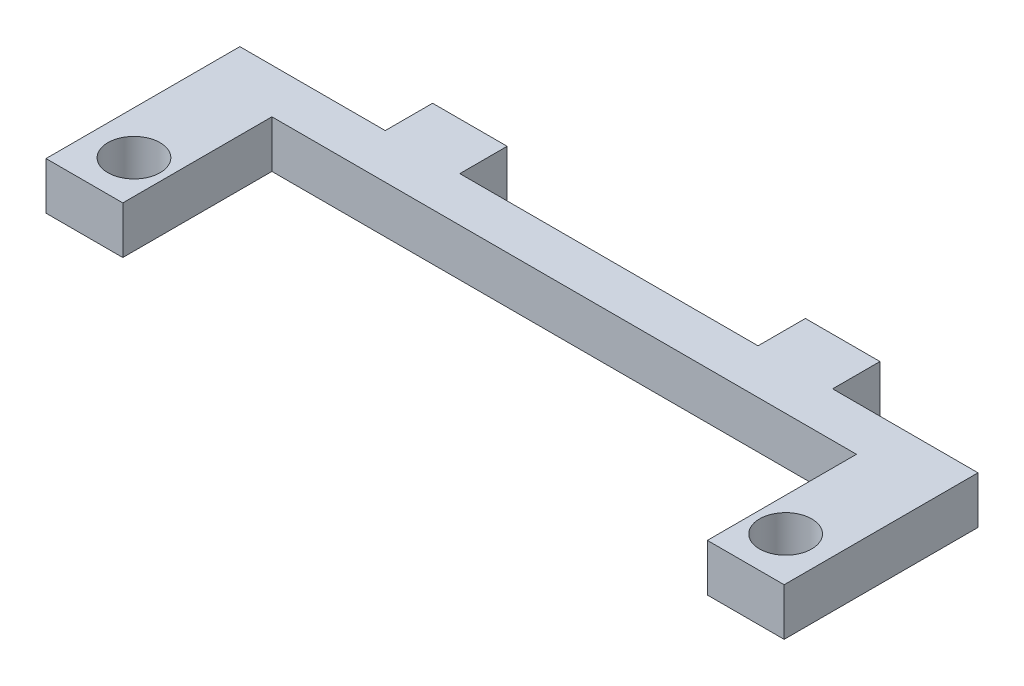
ISO-10303-21;
HEADER;
FILE_DESCRIPTION(('STEP AP214'),'2;1');
FILE_NAME('part.step','',(''),(''),'','','');
FILE_SCHEMA(('AUTOMOTIVE_DESIGN { 1 0 10303 214 1 1 1 1 }'));
ENDSEC;
DATA;
#1=APPLICATION_CONTEXT('core data for automotive mechanical design processes');
#2=APPLICATION_PROTOCOL_DEFINITION('international standard','automotive_design',2000,#1);
#3=PRODUCT_CONTEXT('',#1,'mechanical');
#4=PRODUCT('Part','Part','',(#3));
#5=PRODUCT_RELATED_PRODUCT_CATEGORY('part','',(#4));
#6=PRODUCT_DEFINITION_FORMATION('','',#4);
#7=PRODUCT_DEFINITION_CONTEXT('part definition',#1,'design');
#8=PRODUCT_DEFINITION('design','',#6,#7);
#9=PRODUCT_DEFINITION_SHAPE('','',#8);
#10=(LENGTH_UNIT() NAMED_UNIT(*) SI_UNIT(.MILLI.,.METRE.));
#11=(NAMED_UNIT(*) PLANE_ANGLE_UNIT() SI_UNIT($,.RADIAN.));
#12=(NAMED_UNIT(*) SI_UNIT($,.STERADIAN.) SOLID_ANGLE_UNIT());
#13=UNCERTAINTY_MEASURE_WITH_UNIT(LENGTH_MEASURE(1.E-05),#10,'distance_accuracy_value','');
#14=(GEOMETRIC_REPRESENTATION_CONTEXT(3) GLOBAL_UNCERTAINTY_ASSIGNED_CONTEXT((#13)) GLOBAL_UNIT_ASSIGNED_CONTEXT((#10,
#11,#12)) REPRESENTATION_CONTEXT('',''));
#15=CARTESIAN_POINT('',(0.,0.,0.));
#16=DIRECTION('',(0.,0.,1.));
#17=DIRECTION('',(1.,0.,0.));
#18=AXIS2_PLACEMENT_3D('',#15,#16,#17);
#19=CARTESIAN_POINT('',(0.,3.175,0.));
#20=DIRECTION('',(0.,1.,0.));
#21=DIRECTION('',(0.,0.,1.));
#22=AXIS2_PLACEMENT_3D('',#19,#20,#21);
#23=PLANE('',#22);
#24=CARTESIAN_POINT('',(-21.85,3.175,0.));
#25=DIRECTION('',(0.,1.,0.));
#26=DIRECTION('',(0.,0.,1.));
#27=AXIS2_PLACEMENT_3D('',#24,#25,#26);
#28=CIRCLE('',#27,1.75);
#29=CARTESIAN_POINT('',(-21.85,3.175,1.75));
#30=VERTEX_POINT('',#29);
#31=EDGE_CURVE('E182',#30,#30,#28,.T.);
#32=ORIENTED_EDGE('',*,*,#31,.F.);
#33=EDGE_LOOP('',(#32));
#34=FACE_BOUND('',#33,.T.);
#35=DIRECTION('',(-1.,0.,0.));
#36=VECTOR('',#35,1.);
#37=CARTESIAN_POINT('',(15.,3.175,-10.));
#38=LINE('',#37,#36);
#39=CARTESIAN_POINT('',(24.75,3.175,-10.));
#40=VERTEX_POINT('',#39);
#41=CARTESIAN_POINT('',(15.,3.175,-10.));
#42=VERTEX_POINT('',#41);
#43=EDGE_CURVE('E209',#40,#42,#38,.T.);
#44=ORIENTED_EDGE('',*,*,#43,.T.);
#45=DIRECTION('',(0.,0.,-1.));
#46=VECTOR('',#45,1.);
#47=CARTESIAN_POINT('',(15.,3.175,-10.));
#48=LINE('',#47,#46);
#49=CARTESIAN_POINT('',(15.,3.175,-13.175));
#50=VERTEX_POINT('',#49);
#51=EDGE_CURVE('E117',#42,#50,#48,.T.);
#52=ORIENTED_EDGE('',*,*,#51,.T.);
#53=DIRECTION('',(-1.,0.,0.));
#54=VECTOR('',#53,1.);
#55=CARTESIAN_POINT('',(10.,3.175,-13.175));
#56=LINE('',#55,#54);
#57=CARTESIAN_POINT('',(10.,3.175,-13.175));
#58=VERTEX_POINT('',#57);
#59=EDGE_CURVE('E248',#50,#58,#56,.T.);
#60=ORIENTED_EDGE('',*,*,#59,.T.);
#61=DIRECTION('',(0.,0.,1.));
#62=VECTOR('',#61,1.);
#63=CARTESIAN_POINT('',(10.,3.175,-10.));
#64=LINE('',#63,#62);
#65=CARTESIAN_POINT('',(10.,3.175,-10.));
#66=VERTEX_POINT('',#65);
#67=EDGE_CURVE('E267',#58,#66,#64,.T.);
#68=ORIENTED_EDGE('',*,*,#67,.T.);
#69=DIRECTION('',(-1.,0.,0.));
#70=VECTOR('',#69,1.);
#71=CARTESIAN_POINT('',(-10.,3.175,-10.));
#72=LINE('',#71,#70);
#73=CARTESIAN_POINT('',(-10.,3.175,-10.));
#74=VERTEX_POINT('',#73);
#75=EDGE_CURVE('E264',#66,#74,#72,.T.);
#76=ORIENTED_EDGE('',*,*,#75,.T.);
#77=DIRECTION('',(0.,0.,-1.));
#78=VECTOR('',#77,1.);
#79=CARTESIAN_POINT('',(-10.,3.175,-10.));
#80=LINE('',#79,#78);
#81=CARTESIAN_POINT('',(-10.,3.175,-13.175));
#82=VERTEX_POINT('',#81);
#83=EDGE_CURVE('E266',#74,#82,#80,.T.);
#84=ORIENTED_EDGE('',*,*,#83,.T.);
#85=DIRECTION('',(-1.,0.,0.));
#86=VECTOR('',#85,1.);
#87=CARTESIAN_POINT('',(-15.,3.175,-13.175));
#88=LINE('',#87,#86);
#89=CARTESIAN_POINT('',(-15.,3.175,-13.175));
#90=VERTEX_POINT('',#89);
#91=EDGE_CURVE('E269',#82,#90,#88,.T.);
#92=ORIENTED_EDGE('',*,*,#91,.T.);
#93=DIRECTION('',(0.,0.,1.));
#94=VECTOR('',#93,1.);
#95=CARTESIAN_POINT('',(-15.,3.175,-10.));
#96=LINE('',#95,#94);
#97=CARTESIAN_POINT('',(-15.,3.175,-10.));
#98=VERTEX_POINT('',#97);
#99=EDGE_CURVE('E275',#90,#98,#96,.T.);
#100=ORIENTED_EDGE('',*,*,#99,.T.);
#101=DIRECTION('',(-1.,0.,0.));
#102=VECTOR('',#101,1.);
#103=CARTESIAN_POINT('',(-24.75,3.175,-10.));
#104=LINE('',#103,#102);
#105=CARTESIAN_POINT('',(-24.75,3.175,-10.));
#106=VERTEX_POINT('',#105);
#107=EDGE_CURVE('E277',#98,#106,#104,.T.);
#108=ORIENTED_EDGE('',*,*,#107,.T.);
#109=DIRECTION('',(0.,0.,1.));
#110=VECTOR('',#109,1.);
#111=CARTESIAN_POINT('',(-24.75,3.175,3.));
#112=LINE('',#111,#110);
#113=CARTESIAN_POINT('',(-24.75,3.175,3.));
#114=VERTEX_POINT('',#113);
#115=EDGE_CURVE('E279',#106,#114,#112,.T.);
#116=ORIENTED_EDGE('',*,*,#115,.T.);
#117=DIRECTION('',(1.,0.,0.));
#118=VECTOR('',#117,1.);
#119=CARTESIAN_POINT('',(-24.75,3.175,3.));
#120=LINE('',#119,#118);
#121=CARTESIAN_POINT('',(-19.6,3.175,3.));
#122=VERTEX_POINT('',#121);
#123=EDGE_CURVE('E281',#114,#122,#120,.T.);
#124=ORIENTED_EDGE('',*,*,#123,.T.);
#125=DIRECTION('',(0.,0.,-1.));
#126=VECTOR('',#125,1.);
#127=CARTESIAN_POINT('',(-19.6,3.175,3.));
#128=LINE('',#127,#126);
#129=CARTESIAN_POINT('',(-19.6,3.175,-7.));
#130=VERTEX_POINT('',#129);
#131=EDGE_CURVE('E283',#122,#130,#128,.T.);
#132=ORIENTED_EDGE('',*,*,#131,.T.);
#133=DIRECTION('',(1.,0.,0.));
#134=VECTOR('',#133,1.);
#135=CARTESIAN_POINT('',(-19.6,3.175,-7.));
#136=LINE('',#135,#134);
#137=CARTESIAN_POINT('',(19.6,3.175,-7.));
#138=VERTEX_POINT('',#137);
#139=EDGE_CURVE('E160',#130,#138,#136,.T.);
#140=ORIENTED_EDGE('',*,*,#139,.T.);
#141=DIRECTION('',(0.,0.,1.));
#142=VECTOR('',#141,1.);
#143=CARTESIAN_POINT('',(19.6,3.175,-7.));
#144=LINE('',#143,#142);
#145=CARTESIAN_POINT('',(19.6,3.175,3.));
#146=VERTEX_POINT('',#145);
#147=EDGE_CURVE('E154',#138,#146,#144,.T.);
#148=ORIENTED_EDGE('',*,*,#147,.T.);
#149=DIRECTION('',(1.,0.,0.));
#150=VECTOR('',#149,1.);
#151=CARTESIAN_POINT('',(19.6,3.175,3.));
#152=LINE('',#151,#150);
#153=CARTESIAN_POINT('',(24.75,3.175,3.));
#154=VERTEX_POINT('',#153);
#155=EDGE_CURVE('E158',#146,#154,#152,.T.);
#156=ORIENTED_EDGE('',*,*,#155,.T.);
#157=DIRECTION('',(0.,0.,-1.));
#158=VECTOR('',#157,1.);
#159=CARTESIAN_POINT('',(24.75,3.175,3.));
#160=LINE('',#159,#158);
#161=EDGE_CURVE('E50',#154,#40,#160,.T.);
#162=ORIENTED_EDGE('',*,*,#161,.T.);
#163=EDGE_LOOP('',(#44,#52,#60,#68,#76,#84,#92,#100,#108,#116,#124,#132,#140,#148,#156,#162));
#164=FACE_BOUND('',#163,.T.);
#165=CARTESIAN_POINT('',(21.85,3.175,0.));
#166=DIRECTION('',(0.,1.,0.));
#167=DIRECTION('',(0.,0.,1.));
#168=AXIS2_PLACEMENT_3D('',#165,#166,#167);
#169=CIRCLE('',#168,1.75);
#170=CARTESIAN_POINT('',(21.85,3.175,1.75));
#171=VERTEX_POINT('',#170);
#172=EDGE_CURVE('E326',#171,#171,#169,.T.);
#173=ORIENTED_EDGE('',*,*,#172,.F.);
#174=EDGE_LOOP('',(#173));
#175=FACE_BOUND('',#174,.T.);
#176=ADVANCED_FACE('F33',(#34,#164,#175),#23,.T.);
#177=CARTESIAN_POINT('',(0.,0.,0.));
#178=DIRECTION('',(0.,1.,0.));
#179=DIRECTION('',(0.,0.,1.));
#180=AXIS2_PLACEMENT_3D('',#177,#178,#179);
#181=PLANE('',#180);
#182=CARTESIAN_POINT('',(-21.85,0.,0.));
#183=DIRECTION('',(0.,1.,0.));
#184=DIRECTION('',(0.,0.,1.));
#185=AXIS2_PLACEMENT_3D('',#182,#183,#184);
#186=CIRCLE('',#185,1.75);
#187=CARTESIAN_POINT('',(-21.85,0.,1.75));
#188=VERTEX_POINT('',#187);
#189=EDGE_CURVE('E331',#188,#188,#186,.T.);
#190=ORIENTED_EDGE('',*,*,#189,.T.);
#191=EDGE_LOOP('',(#190));
#192=FACE_BOUND('',#191,.T.);
#193=DIRECTION('',(-1.,0.,0.));
#194=VECTOR('',#193,1.);
#195=CARTESIAN_POINT('',(15.,0.,-10.));
#196=LINE('',#195,#194);
#197=CARTESIAN_POINT('',(24.75,0.,-10.));
#198=VERTEX_POINT('',#197);
#199=CARTESIAN_POINT('',(15.,0.,-10.));
#200=VERTEX_POINT('',#199);
#201=EDGE_CURVE('E178',#198,#200,#196,.T.);
#202=ORIENTED_EDGE('',*,*,#201,.F.);
#203=DIRECTION('',(0.,0.,-1.));
#204=VECTOR('',#203,1.);
#205=CARTESIAN_POINT('',(24.75,0.,3.));
#206=LINE('',#205,#204);
#207=CARTESIAN_POINT('',(24.75,0.,3.));
#208=VERTEX_POINT('',#207);
#209=EDGE_CURVE('E109',#208,#198,#206,.T.);
#210=ORIENTED_EDGE('',*,*,#209,.F.);
#211=DIRECTION('',(1.,0.,0.));
#212=VECTOR('',#211,1.);
#213=CARTESIAN_POINT('',(19.6,0.,3.));
#214=LINE('',#213,#212);
#215=CARTESIAN_POINT('',(19.6,0.,3.));
#216=VERTEX_POINT('',#215);
#217=EDGE_CURVE('E103',#216,#208,#214,.T.);
#218=ORIENTED_EDGE('',*,*,#217,.F.);
#219=DIRECTION('',(0.,0.,1.));
#220=VECTOR('',#219,1.);
#221=CARTESIAN_POINT('',(19.6,0.,-7.));
#222=LINE('',#221,#220);
#223=CARTESIAN_POINT('',(19.6,0.,-7.));
#224=VERTEX_POINT('',#223);
#225=EDGE_CURVE('E168',#224,#216,#222,.T.);
#226=ORIENTED_EDGE('',*,*,#225,.F.);
#227=DIRECTION('',(1.,0.,0.));
#228=VECTOR('',#227,1.);
#229=CARTESIAN_POINT('',(-19.6,0.,-7.));
#230=LINE('',#229,#228);
#231=CARTESIAN_POINT('',(-19.6,0.,-7.));
#232=VERTEX_POINT('',#231);
#233=EDGE_CURVE('E204',#232,#224,#230,.T.);
#234=ORIENTED_EDGE('',*,*,#233,.F.);
#235=DIRECTION('',(0.,0.,-1.));
#236=VECTOR('',#235,1.);
#237=CARTESIAN_POINT('',(-19.6,0.,3.));
#238=LINE('',#237,#236);
#239=CARTESIAN_POINT('',(-19.6,0.,3.));
#240=VERTEX_POINT('',#239);
#241=EDGE_CURVE('E202',#240,#232,#238,.T.);
#242=ORIENTED_EDGE('',*,*,#241,.F.);
#243=DIRECTION('',(1.,0.,0.));
#244=VECTOR('',#243,1.);
#245=CARTESIAN_POINT('',(-24.75,0.,3.));
#246=LINE('',#245,#244);
#247=CARTESIAN_POINT('',(-24.75,0.,3.));
#248=VERTEX_POINT('',#247);
#249=EDGE_CURVE('E200',#248,#240,#246,.T.);
#250=ORIENTED_EDGE('',*,*,#249,.F.);
#251=DIRECTION('',(0.,0.,1.));
#252=VECTOR('',#251,1.);
#253=CARTESIAN_POINT('',(-24.75,0.,3.));
#254=LINE('',#253,#252);
#255=CARTESIAN_POINT('',(-24.75,0.,-10.));
#256=VERTEX_POINT('',#255);
#257=EDGE_CURVE('E198',#256,#248,#254,.T.);
#258=ORIENTED_EDGE('',*,*,#257,.F.);
#259=DIRECTION('',(-1.,0.,0.));
#260=VECTOR('',#259,1.);
#261=CARTESIAN_POINT('',(-24.75,0.,-10.));
#262=LINE('',#261,#260);
#263=CARTESIAN_POINT('',(-15.,0.,-10.));
#264=VERTEX_POINT('',#263);
#265=EDGE_CURVE('E196',#264,#256,#262,.T.);
#266=ORIENTED_EDGE('',*,*,#265,.F.);
#267=DIRECTION('',(0.,0.,1.));
#268=VECTOR('',#267,1.);
#269=CARTESIAN_POINT('',(-15.,0.,-10.));
#270=LINE('',#269,#268);
#271=CARTESIAN_POINT('',(-15.,0.,-13.175));
#272=VERTEX_POINT('',#271);
#273=EDGE_CURVE('E194',#272,#264,#270,.T.);
#274=ORIENTED_EDGE('',*,*,#273,.F.);
#275=DIRECTION('',(-1.,0.,0.));
#276=VECTOR('',#275,1.);
#277=CARTESIAN_POINT('',(-15.,0.,-13.175));
#278=LINE('',#277,#276);
#279=CARTESIAN_POINT('',(-10.,0.,-13.175));
#280=VERTEX_POINT('',#279);
#281=EDGE_CURVE('E192',#280,#272,#278,.T.);
#282=ORIENTED_EDGE('',*,*,#281,.F.);
#283=DIRECTION('',(0.,0.,-1.));
#284=VECTOR('',#283,1.);
#285=CARTESIAN_POINT('',(-10.,0.,-10.));
#286=LINE('',#285,#284);
#287=CARTESIAN_POINT('',(-10.,0.,-10.));
#288=VERTEX_POINT('',#287);
#289=EDGE_CURVE('E190',#288,#280,#286,.T.);
#290=ORIENTED_EDGE('',*,*,#289,.F.);
#291=DIRECTION('',(-1.,0.,0.));
#292=VECTOR('',#291,1.);
#293=CARTESIAN_POINT('',(-10.,0.,-10.));
#294=LINE('',#293,#292);
#295=CARTESIAN_POINT('',(10.,0.,-10.));
#296=VERTEX_POINT('',#295);
#297=EDGE_CURVE('E188',#296,#288,#294,.T.);
#298=ORIENTED_EDGE('',*,*,#297,.F.);
#299=DIRECTION('',(0.,0.,1.));
#300=VECTOR('',#299,1.);
#301=CARTESIAN_POINT('',(10.,0.,-10.));
#302=LINE('',#301,#300);
#303=CARTESIAN_POINT('',(10.,0.,-13.175));
#304=VERTEX_POINT('',#303);
#305=EDGE_CURVE('E186',#304,#296,#302,.T.);
#306=ORIENTED_EDGE('',*,*,#305,.F.);
#307=DIRECTION('',(-1.,0.,0.));
#308=VECTOR('',#307,1.);
#309=CARTESIAN_POINT('',(10.,0.,-13.175));
#310=LINE('',#309,#308);
#311=CARTESIAN_POINT('',(15.,0.,-13.175));
#312=VERTEX_POINT('',#311);
#313=EDGE_CURVE('E184',#312,#304,#310,.T.);
#314=ORIENTED_EDGE('',*,*,#313,.F.);
#315=DIRECTION('',(0.,0.,-1.));
#316=VECTOR('',#315,1.);
#317=CARTESIAN_POINT('',(15.,0.,-10.));
#318=LINE('',#317,#316);
#319=EDGE_CURVE('E181',#200,#312,#318,.T.);
#320=ORIENTED_EDGE('',*,*,#319,.F.);
#321=EDGE_LOOP('',(#202,#210,#218,#226,#234,#242,#250,#258,#266,#274,#282,#290,#298,#306,#314,#320));
#322=FACE_BOUND('',#321,.T.);
#323=CARTESIAN_POINT('',(21.85,0.,0.));
#324=DIRECTION('',(0.,1.,0.));
#325=DIRECTION('',(0.,0.,1.));
#326=AXIS2_PLACEMENT_3D('',#323,#324,#325);
#327=CIRCLE('',#326,1.75);
#328=CARTESIAN_POINT('',(21.85,0.,1.75));
#329=VERTEX_POINT('',#328);
#330=EDGE_CURVE('E329',#329,#329,#327,.T.);
#331=ORIENTED_EDGE('',*,*,#330,.T.);
#332=EDGE_LOOP('',(#331));
#333=FACE_BOUND('',#332,.T.);
#334=ADVANCED_FACE('F252',(#192,#322,#333),#181,.F.);
#335=CARTESIAN_POINT('',(15.,3.175,-10.));
#336=DIRECTION('',(0.,0.,1.));
#337=DIRECTION('',(1.,0.,0.));
#338=AXIS2_PLACEMENT_3D('',#335,#336,#337);
#339=PLANE('',#338);
#340=ORIENTED_EDGE('',*,*,#201,.T.);
#341=DIRECTION('',(0.,-1.,0.));
#342=VECTOR('',#341,1.);
#343=CARTESIAN_POINT('',(15.,3.175,-10.));
#344=LINE('',#343,#342);
#345=EDGE_CURVE('E11',#42,#200,#344,.T.);
#346=ORIENTED_EDGE('',*,*,#345,.F.);
#347=ORIENTED_EDGE('',*,*,#43,.F.);
#348=DIRECTION('',(0.,-1.,0.));
#349=VECTOR('',#348,1.);
#350=CARTESIAN_POINT('',(24.75,3.175,-10.));
#351=LINE('',#350,#349);
#352=EDGE_CURVE('E174',#40,#198,#351,.T.);
#353=ORIENTED_EDGE('',*,*,#352,.T.);
#354=EDGE_LOOP('',(#340,#346,#347,#353));
#355=FACE_BOUND('',#354,.T.);
#356=ADVANCED_FACE('F35',(#355),#339,.F.);
#357=CARTESIAN_POINT('',(15.,3.175,-10.));
#358=DIRECTION('',(-1.,0.,0.));
#359=DIRECTION('',(0.,0.,1.));
#360=AXIS2_PLACEMENT_3D('',#357,#358,#359);
#361=PLANE('',#360);
#362=ORIENTED_EDGE('',*,*,#319,.T.);
#363=DIRECTION('',(0.,-1.,0.));
#364=VECTOR('',#363,1.);
#365=CARTESIAN_POINT('',(15.,3.175,-13.175));
#366=LINE('',#365,#364);
#367=EDGE_CURVE('E42',#50,#312,#366,.T.);
#368=ORIENTED_EDGE('',*,*,#367,.F.);
#369=ORIENTED_EDGE('',*,*,#51,.F.);
#370=ORIENTED_EDGE('',*,*,#345,.T.);
#371=EDGE_LOOP('',(#362,#368,#369,#370));
#372=FACE_BOUND('',#371,.T.);
#373=ADVANCED_FACE('F464',(#372),#361,.F.);
#374=CARTESIAN_POINT('',(10.,3.175,-13.175));
#375=DIRECTION('',(0.,0.,1.));
#376=DIRECTION('',(1.,0.,0.));
#377=AXIS2_PLACEMENT_3D('',#374,#375,#376);
#378=PLANE('',#377);
#379=ORIENTED_EDGE('',*,*,#313,.T.);
#380=DIRECTION('',(0.,-1.,0.));
#381=VECTOR('',#380,1.);
#382=CARTESIAN_POINT('',(10.,3.175,-13.175));
#383=LINE('',#382,#381);
#384=EDGE_CURVE('E240',#58,#304,#383,.T.);
#385=ORIENTED_EDGE('',*,*,#384,.F.);
#386=ORIENTED_EDGE('',*,*,#59,.F.);
#387=ORIENTED_EDGE('',*,*,#367,.T.);
#388=EDGE_LOOP('',(#379,#385,#386,#387));
#389=FACE_BOUND('',#388,.T.);
#390=ADVANCED_FACE('F246',(#389),#378,.F.);
#391=CARTESIAN_POINT('',(10.,3.175,-10.));
#392=DIRECTION('',(1.,0.,0.));
#393=DIRECTION('',(0.,0.,-1.));
#394=AXIS2_PLACEMENT_3D('',#391,#392,#393);
#395=PLANE('',#394);
#396=ORIENTED_EDGE('',*,*,#305,.T.);
#397=DIRECTION('',(0.,-1.,0.));
#398=VECTOR('',#397,1.);
#399=CARTESIAN_POINT('',(10.,3.175,-10.));
#400=LINE('',#399,#398);
#401=EDGE_CURVE('E237',#66,#296,#400,.T.);
#402=ORIENTED_EDGE('',*,*,#401,.F.);
#403=ORIENTED_EDGE('',*,*,#67,.F.);
#404=ORIENTED_EDGE('',*,*,#384,.T.);
#405=EDGE_LOOP('',(#396,#402,#403,#404));
#406=FACE_BOUND('',#405,.T.);
#407=ADVANCED_FACE('F258',(#406),#395,.F.);
#408=CARTESIAN_POINT('',(-10.,3.175,-10.));
#409=DIRECTION('',(0.,0.,1.));
#410=DIRECTION('',(1.,0.,0.));
#411=AXIS2_PLACEMENT_3D('',#408,#409,#410);
#412=PLANE('',#411);
#413=ORIENTED_EDGE('',*,*,#297,.T.);
#414=DIRECTION('',(0.,-1.,0.));
#415=VECTOR('',#414,1.);
#416=CARTESIAN_POINT('',(-10.,3.175,-10.));
#417=LINE('',#416,#415);
#418=EDGE_CURVE('E234',#74,#288,#417,.T.);
#419=ORIENTED_EDGE('',*,*,#418,.F.);
#420=ORIENTED_EDGE('',*,*,#75,.F.);
#421=ORIENTED_EDGE('',*,*,#401,.T.);
#422=EDGE_LOOP('',(#413,#419,#420,#421));
#423=FACE_BOUND('',#422,.T.);
#424=ADVANCED_FACE('F262',(#423),#412,.F.);
#425=CARTESIAN_POINT('',(-10.,3.175,-10.));
#426=DIRECTION('',(-1.,0.,0.));
#427=DIRECTION('',(0.,0.,1.));
#428=AXIS2_PLACEMENT_3D('',#425,#426,#427);
#429=PLANE('',#428);
#430=ORIENTED_EDGE('',*,*,#289,.T.);
#431=DIRECTION('',(0.,-1.,0.));
#432=VECTOR('',#431,1.);
#433=CARTESIAN_POINT('',(-10.,3.175,-13.175));
#434=LINE('',#433,#432);
#435=EDGE_CURVE('E231',#82,#280,#434,.T.);
#436=ORIENTED_EDGE('',*,*,#435,.F.);
#437=ORIENTED_EDGE('',*,*,#83,.F.);
#438=ORIENTED_EDGE('',*,*,#418,.T.);
#439=EDGE_LOOP('',(#430,#436,#437,#438));
#440=FACE_BOUND('',#439,.T.);
#441=ADVANCED_FACE('F429',(#440),#429,.F.);
#442=CARTESIAN_POINT('',(-15.,3.175,-13.175));
#443=DIRECTION('',(0.,0.,1.));
#444=DIRECTION('',(1.,0.,0.));
#445=AXIS2_PLACEMENT_3D('',#442,#443,#444);
#446=PLANE('',#445);
#447=ORIENTED_EDGE('',*,*,#281,.T.);
#448=DIRECTION('',(0.,-1.,0.));
#449=VECTOR('',#448,1.);
#450=CARTESIAN_POINT('',(-15.,3.175,-13.175));
#451=LINE('',#450,#449);
#452=EDGE_CURVE('E228',#90,#272,#451,.T.);
#453=ORIENTED_EDGE('',*,*,#452,.F.);
#454=ORIENTED_EDGE('',*,*,#91,.F.);
#455=ORIENTED_EDGE('',*,*,#435,.T.);
#456=EDGE_LOOP('',(#447,#453,#454,#455));
#457=FACE_BOUND('',#456,.T.);
#458=ADVANCED_FACE('F419',(#457),#446,.F.);
#459=CARTESIAN_POINT('',(-15.,3.175,-10.));
#460=DIRECTION('',(1.,0.,0.));
#461=DIRECTION('',(0.,0.,-1.));
#462=AXIS2_PLACEMENT_3D('',#459,#460,#461);
#463=PLANE('',#462);
#464=ORIENTED_EDGE('',*,*,#273,.T.);
#465=DIRECTION('',(0.,-1.,0.));
#466=VECTOR('',#465,1.);
#467=CARTESIAN_POINT('',(-15.,3.175,-10.));
#468=LINE('',#467,#466);
#469=EDGE_CURVE('E225',#98,#264,#468,.T.);
#470=ORIENTED_EDGE('',*,*,#469,.F.);
#471=ORIENTED_EDGE('',*,*,#99,.F.);
#472=ORIENTED_EDGE('',*,*,#452,.T.);
#473=EDGE_LOOP('',(#464,#470,#471,#472));
#474=FACE_BOUND('',#473,.T.);
#475=ADVANCED_FACE('F409',(#474),#463,.F.);
#476=CARTESIAN_POINT('',(-24.75,3.175,-10.));
#477=DIRECTION('',(0.,0.,1.));
#478=DIRECTION('',(1.,0.,0.));
#479=AXIS2_PLACEMENT_3D('',#476,#477,#478);
#480=PLANE('',#479);
#481=ORIENTED_EDGE('',*,*,#265,.T.);
#482=DIRECTION('',(0.,-1.,0.));
#483=VECTOR('',#482,1.);
#484=CARTESIAN_POINT('',(-24.75,3.175,-10.));
#485=LINE('',#484,#483);
#486=EDGE_CURVE('E222',#106,#256,#485,.T.);
#487=ORIENTED_EDGE('',*,*,#486,.F.);
#488=ORIENTED_EDGE('',*,*,#107,.F.);
#489=ORIENTED_EDGE('',*,*,#469,.T.);
#490=EDGE_LOOP('',(#481,#487,#488,#489));
#491=FACE_BOUND('',#490,.T.);
#492=ADVANCED_FACE('F399',(#491),#480,.F.);
#493=CARTESIAN_POINT('',(-24.75,3.175,3.));
#494=DIRECTION('',(1.,0.,0.));
#495=DIRECTION('',(0.,0.,-1.));
#496=AXIS2_PLACEMENT_3D('',#493,#494,#495);
#497=PLANE('',#496);
#498=ORIENTED_EDGE('',*,*,#257,.T.);
#499=DIRECTION('',(0.,-1.,0.));
#500=VECTOR('',#499,1.);
#501=CARTESIAN_POINT('',(-24.75,3.175,3.));
#502=LINE('',#501,#500);
#503=EDGE_CURVE('E219',#114,#248,#502,.T.);
#504=ORIENTED_EDGE('',*,*,#503,.F.);
#505=ORIENTED_EDGE('',*,*,#115,.F.);
#506=ORIENTED_EDGE('',*,*,#486,.T.);
#507=EDGE_LOOP('',(#498,#504,#505,#506));
#508=FACE_BOUND('',#507,.T.);
#509=ADVANCED_FACE('F389',(#508),#497,.F.);
#510=CARTESIAN_POINT('',(-24.75,3.175,3.));
#511=DIRECTION('',(0.,0.,-1.));
#512=DIRECTION('',(-1.,0.,0.));
#513=AXIS2_PLACEMENT_3D('',#510,#511,#512);
#514=PLANE('',#513);
#515=ORIENTED_EDGE('',*,*,#249,.T.);
#516=DIRECTION('',(0.,-1.,0.));
#517=VECTOR('',#516,1.);
#518=CARTESIAN_POINT('',(-19.6,3.175,3.));
#519=LINE('',#518,#517);
#520=EDGE_CURVE('E216',#122,#240,#519,.T.);
#521=ORIENTED_EDGE('',*,*,#520,.F.);
#522=ORIENTED_EDGE('',*,*,#123,.F.);
#523=ORIENTED_EDGE('',*,*,#503,.T.);
#524=EDGE_LOOP('',(#515,#521,#522,#523));
#525=FACE_BOUND('',#524,.T.);
#526=ADVANCED_FACE('F380',(#525),#514,.F.);
#527=CARTESIAN_POINT('',(-19.6,3.175,3.));
#528=DIRECTION('',(-1.,0.,0.));
#529=DIRECTION('',(0.,0.,1.));
#530=AXIS2_PLACEMENT_3D('',#527,#528,#529);
#531=PLANE('',#530);
#532=ORIENTED_EDGE('',*,*,#241,.T.);
#533=DIRECTION('',(0.,-1.,0.));
#534=VECTOR('',#533,1.);
#535=CARTESIAN_POINT('',(-19.6,3.175,-7.));
#536=LINE('',#535,#534);
#537=EDGE_CURVE('E213',#130,#232,#536,.T.);
#538=ORIENTED_EDGE('',*,*,#537,.F.);
#539=ORIENTED_EDGE('',*,*,#131,.F.);
#540=ORIENTED_EDGE('',*,*,#520,.T.);
#541=EDGE_LOOP('',(#532,#538,#539,#540));
#542=FACE_BOUND('',#541,.T.);
#543=ADVANCED_FACE('F289',(#542),#531,.F.);
#544=CARTESIAN_POINT('',(-19.6,3.175,-7.));
#545=DIRECTION('',(0.,0.,-1.));
#546=DIRECTION('',(-1.,0.,0.));
#547=AXIS2_PLACEMENT_3D('',#544,#545,#546);
#548=PLANE('',#547);
#549=ORIENTED_EDGE('',*,*,#233,.T.);
#550=DIRECTION('',(0.,-1.,0.));
#551=VECTOR('',#550,1.);
#552=CARTESIAN_POINT('',(19.6,3.175,-7.));
#553=LINE('',#552,#551);
#554=EDGE_CURVE('E169',#138,#224,#553,.T.);
#555=ORIENTED_EDGE('',*,*,#554,.F.);
#556=ORIENTED_EDGE('',*,*,#139,.F.);
#557=ORIENTED_EDGE('',*,*,#537,.T.);
#558=EDGE_LOOP('',(#549,#555,#556,#557));
#559=FACE_BOUND('',#558,.T.);
#560=ADVANCED_FACE('F293',(#559),#548,.F.);
#561=CARTESIAN_POINT('',(19.6,3.175,-7.));
#562=DIRECTION('',(1.,0.,0.));
#563=DIRECTION('',(0.,0.,-1.));
#564=AXIS2_PLACEMENT_3D('',#561,#562,#563);
#565=PLANE('',#564);
#566=ORIENTED_EDGE('',*,*,#225,.T.);
#567=DIRECTION('',(0.,-1.,0.));
#568=VECTOR('',#567,1.);
#569=CARTESIAN_POINT('',(19.6,3.175,3.));
#570=LINE('',#569,#568);
#571=EDGE_CURVE('E165',#146,#216,#570,.T.);
#572=ORIENTED_EDGE('',*,*,#571,.F.);
#573=ORIENTED_EDGE('',*,*,#147,.F.);
#574=ORIENTED_EDGE('',*,*,#554,.T.);
#575=EDGE_LOOP('',(#566,#572,#573,#574));
#576=FACE_BOUND('',#575,.T.);
#577=ADVANCED_FACE('F166',(#576),#565,.F.);
#578=CARTESIAN_POINT('',(19.6,3.175,3.));
#579=DIRECTION('',(0.,0.,-1.));
#580=DIRECTION('',(-1.,0.,0.));
#581=AXIS2_PLACEMENT_3D('',#578,#579,#580);
#582=PLANE('',#581);
#583=ORIENTED_EDGE('',*,*,#217,.T.);
#584=DIRECTION('',(0.,-1.,0.));
#585=VECTOR('',#584,1.);
#586=CARTESIAN_POINT('',(24.75,3.175,3.));
#587=LINE('',#586,#585);
#588=EDGE_CURVE('E170',#154,#208,#587,.T.);
#589=ORIENTED_EDGE('',*,*,#588,.F.);
#590=ORIENTED_EDGE('',*,*,#155,.F.);
#591=ORIENTED_EDGE('',*,*,#571,.T.);
#592=EDGE_LOOP('',(#583,#589,#590,#591));
#593=FACE_BOUND('',#592,.T.);
#594=ADVANCED_FACE('F172',(#593),#582,.F.);
#595=CARTESIAN_POINT('',(24.75,3.175,3.));
#596=DIRECTION('',(-1.,0.,0.));
#597=DIRECTION('',(0.,0.,1.));
#598=AXIS2_PLACEMENT_3D('',#595,#596,#597);
#599=PLANE('',#598);
#600=ORIENTED_EDGE('',*,*,#209,.T.);
#601=ORIENTED_EDGE('',*,*,#352,.F.);
#602=ORIENTED_EDGE('',*,*,#161,.F.);
#603=ORIENTED_EDGE('',*,*,#588,.T.);
#604=EDGE_LOOP('',(#600,#601,#602,#603));
#605=FACE_BOUND('',#604,.T.);
#606=ADVANCED_FACE('F297',(#605),#599,.F.);
#607=CARTESIAN_POINT('',(-21.85,3.175,0.));
#608=DIRECTION('',(0.,-1.,0.));
#609=DIRECTION('',(0.,0.,-1.));
#610=AXIS2_PLACEMENT_3D('',#607,#608,#609);
#611=CYLINDRICAL_SURFACE('',#610,1.75);
#612=ORIENTED_EDGE('',*,*,#31,.T.);
#613=EDGE_LOOP('',(#612));
#614=FACE_BOUND('',#613,.T.);
#615=ORIENTED_EDGE('',*,*,#189,.F.);
#616=EDGE_LOOP('',(#615));
#617=FACE_BOUND('',#616,.T.);
#618=ADVANCED_FACE('F299',(#614,#617),#611,.F.);
#619=CARTESIAN_POINT('',(21.85,3.175,0.));
#620=DIRECTION('',(0.,-1.,0.));
#621=DIRECTION('',(0.,0.,-1.));
#622=AXIS2_PLACEMENT_3D('',#619,#620,#621);
#623=CYLINDRICAL_SURFACE('',#622,1.75);
#624=ORIENTED_EDGE('',*,*,#172,.T.);
#625=EDGE_LOOP('',(#624));
#626=FACE_BOUND('',#625,.T.);
#627=ORIENTED_EDGE('',*,*,#330,.F.);
#628=EDGE_LOOP('',(#627));
#629=FACE_BOUND('',#628,.T.);
#630=ADVANCED_FACE('F305',(#626,#629),#623,.F.);
#631=CLOSED_SHELL('',(#176,#334,#356,#373,#390,#407,#424,#441,#458,#475,#492,#509,#526,#543,
#560,#577,#594,#606,#618,#630));
#632=MANIFOLD_SOLID_BREP('B2',#631);
#633=ADVANCED_BREP_SHAPE_REPRESENTATION('',(#18,#632),#14);
#634=SHAPE_DEFINITION_REPRESENTATION(#9,#633);
ENDSEC;
END-ISO-10303-21;
